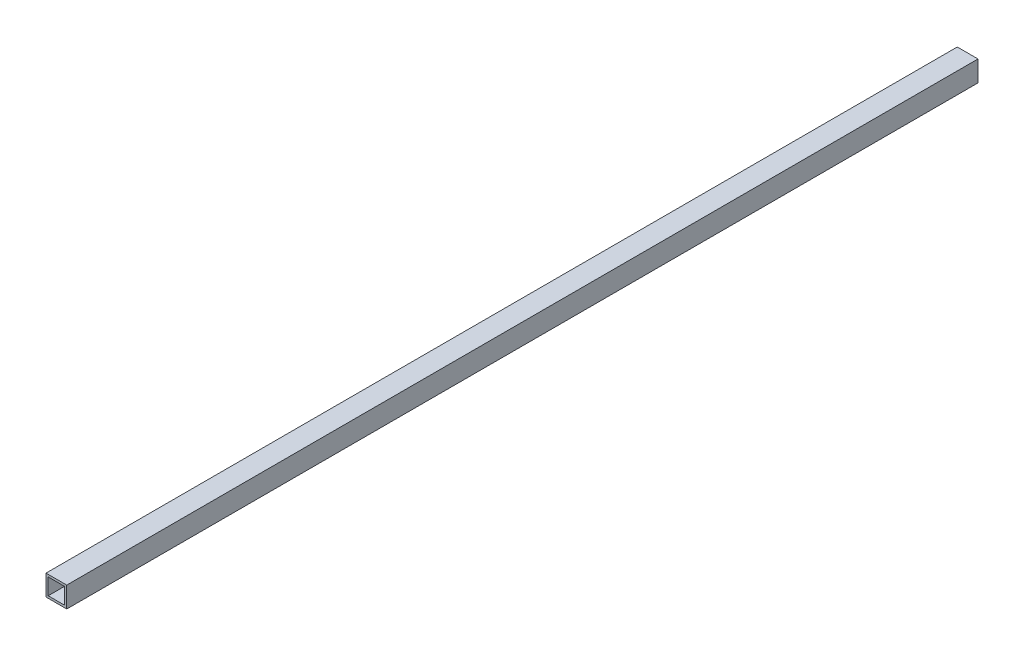
ISO-10303-21;
HEADER;
FILE_DESCRIPTION(('STEP AP214'),'2;1');
FILE_NAME('part.step','',(''),(''),'','','');
FILE_SCHEMA(('AUTOMOTIVE_DESIGN { 1 0 10303 214 1 1 1 1 }'));
ENDSEC;
DATA;
#1=APPLICATION_CONTEXT('core data for automotive mechanical design processes');
#2=APPLICATION_PROTOCOL_DEFINITION('international standard','automotive_design',2000,#1);
#3=PRODUCT_CONTEXT('',#1,'mechanical');
#4=PRODUCT('Part','Part','',(#3));
#5=PRODUCT_RELATED_PRODUCT_CATEGORY('part','',(#4));
#6=PRODUCT_DEFINITION_FORMATION('','',#4);
#7=PRODUCT_DEFINITION_CONTEXT('part definition',#1,'design');
#8=PRODUCT_DEFINITION('design','',#6,#7);
#9=PRODUCT_DEFINITION_SHAPE('','',#8);
#10=(LENGTH_UNIT() NAMED_UNIT(*) SI_UNIT(.MILLI.,.METRE.));
#11=(NAMED_UNIT(*) PLANE_ANGLE_UNIT() SI_UNIT($,.RADIAN.));
#12=(NAMED_UNIT(*) SI_UNIT($,.STERADIAN.) SOLID_ANGLE_UNIT());
#13=UNCERTAINTY_MEASURE_WITH_UNIT(LENGTH_MEASURE(1.E-05),#10,'distance_accuracy_value','');
#14=(GEOMETRIC_REPRESENTATION_CONTEXT(3) GLOBAL_UNCERTAINTY_ASSIGNED_CONTEXT((#13)) GLOBAL_UNIT_ASSIGNED_CONTEXT((#10,
#11,#12)) REPRESENTATION_CONTEXT('',''));
#15=CARTESIAN_POINT('',(0.,0.,0.));
#16=DIRECTION('',(0.,0.,1.));
#17=DIRECTION('',(1.,0.,0.));
#18=AXIS2_PLACEMENT_3D('',#15,#16,#17);
#19=CARTESIAN_POINT('',(0.,0.,615.));
#20=DIRECTION('',(0.,0.,1.));
#21=DIRECTION('',(1.,0.,0.));
#22=AXIS2_PLACEMENT_3D('',#19,#20,#21);
#23=PLANE('',#22);
#24=DIRECTION('',(0.,1.,0.));
#25=VECTOR('',#24,1.);
#26=CARTESIAN_POINT('',(7.,5.5,615.));
#27=LINE('',#26,#25);
#28=CARTESIAN_POINT('',(7.,-7.,615.));
#29=VERTEX_POINT('',#28);
#30=CARTESIAN_POINT('',(7.,7.,615.));
#31=VERTEX_POINT('',#30);
#32=EDGE_CURVE('E157',#29,#31,#27,.T.);
#33=ORIENTED_EDGE('',*,*,#32,.T.);
#34=DIRECTION('',(-1.,0.,0.));
#35=VECTOR('',#34,1.);
#36=CARTESIAN_POINT('',(-5.5,7.,615.));
#37=LINE('',#36,#35);
#38=CARTESIAN_POINT('',(-7.,7.,615.));
#39=VERTEX_POINT('',#38);
#40=EDGE_CURVE('E160',#31,#39,#37,.T.);
#41=ORIENTED_EDGE('',*,*,#40,.T.);
#42=DIRECTION('',(0.,-1.,0.));
#43=VECTOR('',#42,1.);
#44=CARTESIAN_POINT('',(-7.,5.5,615.));
#45=LINE('',#44,#43);
#46=CARTESIAN_POINT('',(-7.,-7.,615.));
#47=VERTEX_POINT('',#46);
#48=EDGE_CURVE('E163',#39,#47,#45,.T.);
#49=ORIENTED_EDGE('',*,*,#48,.T.);
#50=DIRECTION('',(1.,0.,0.));
#51=VECTOR('',#50,1.);
#52=CARTESIAN_POINT('',(-5.5,-7.,615.));
#53=LINE('',#52,#51);
#54=EDGE_CURVE('E165',#47,#29,#53,.T.);
#55=ORIENTED_EDGE('',*,*,#54,.T.);
#56=EDGE_LOOP('',(#33,#41,#49,#55));
#57=FACE_BOUND('',#56,.T.);
#58=DIRECTION('',(-1.,0.,0.));
#59=VECTOR('',#58,1.);
#60=CARTESIAN_POINT('',(-5.5,5.5,615.));
#61=LINE('',#60,#59);
#62=CARTESIAN_POINT('',(5.5,5.5,615.));
#63=VERTEX_POINT('',#62);
#64=CARTESIAN_POINT('',(-5.5,5.5,615.));
#65=VERTEX_POINT('',#64);
#66=EDGE_CURVE('E129',#63,#65,#61,.T.);
#67=ORIENTED_EDGE('',*,*,#66,.F.);
#68=DIRECTION('',(0.,1.,0.));
#69=VECTOR('',#68,1.);
#70=CARTESIAN_POINT('',(5.5,5.5,615.));
#71=LINE('',#70,#69);
#72=CARTESIAN_POINT('',(5.5,-5.5,615.));
#73=VERTEX_POINT('',#72);
#74=EDGE_CURVE('E121',#73,#63,#71,.T.);
#75=ORIENTED_EDGE('',*,*,#74,.F.);
#76=DIRECTION('',(1.,0.,0.));
#77=VECTOR('',#76,1.);
#78=CARTESIAN_POINT('',(-5.5,-5.5,615.));
#79=LINE('',#78,#77);
#80=CARTESIAN_POINT('',(-5.5,-5.5,615.));
#81=VERTEX_POINT('',#80);
#82=EDGE_CURVE('E143',#81,#73,#79,.T.);
#83=ORIENTED_EDGE('',*,*,#82,.F.);
#84=DIRECTION('',(0.,-1.,0.));
#85=VECTOR('',#84,1.);
#86=CARTESIAN_POINT('',(-5.5,5.5,615.));
#87=LINE('',#86,#85);
#88=EDGE_CURVE('E141',#65,#81,#87,.T.);
#89=ORIENTED_EDGE('',*,*,#88,.F.);
#90=EDGE_LOOP('',(#67,#75,#83,#89));
#91=FACE_BOUND('',#90,.T.);
#92=ADVANCED_FACE('F56',(#57,#91),#23,.T.);
#93=CARTESIAN_POINT('',(0.,0.,0.));
#94=DIRECTION('',(0.,0.,1.));
#95=DIRECTION('',(1.,0.,0.));
#96=AXIS2_PLACEMENT_3D('',#93,#94,#95);
#97=PLANE('',#96);
#98=DIRECTION('',(0.,1.,0.));
#99=VECTOR('',#98,1.);
#100=CARTESIAN_POINT('',(7.,5.5,0.));
#101=LINE('',#100,#99);
#102=CARTESIAN_POINT('',(7.,-7.,0.));
#103=VERTEX_POINT('',#102);
#104=CARTESIAN_POINT('',(7.,7.,0.));
#105=VERTEX_POINT('',#104);
#106=EDGE_CURVE('E137',#103,#105,#101,.T.);
#107=ORIENTED_EDGE('',*,*,#106,.F.);
#108=DIRECTION('',(1.,0.,0.));
#109=VECTOR('',#108,1.);
#110=CARTESIAN_POINT('',(-5.5,-7.,0.));
#111=LINE('',#110,#109);
#112=CARTESIAN_POINT('',(-7.,-7.,0.));
#113=VERTEX_POINT('',#112);
#114=EDGE_CURVE('E161',#113,#103,#111,.T.);
#115=ORIENTED_EDGE('',*,*,#114,.F.);
#116=DIRECTION('',(0.,-1.,0.));
#117=VECTOR('',#116,1.);
#118=CARTESIAN_POINT('',(-7.,5.5,0.));
#119=LINE('',#118,#117);
#120=CARTESIAN_POINT('',(-7.,7.,0.));
#121=VERTEX_POINT('',#120);
#122=EDGE_CURVE('E172',#121,#113,#119,.T.);
#123=ORIENTED_EDGE('',*,*,#122,.F.);
#124=DIRECTION('',(-1.,0.,0.));
#125=VECTOR('',#124,1.);
#126=CARTESIAN_POINT('',(-5.5,7.,0.));
#127=LINE('',#126,#125);
#128=EDGE_CURVE('E170',#105,#121,#127,.T.);
#129=ORIENTED_EDGE('',*,*,#128,.F.);
#130=EDGE_LOOP('',(#107,#115,#123,#129));
#131=FACE_BOUND('',#130,.T.);
#132=DIRECTION('',(0.,1.,0.));
#133=VECTOR('',#132,1.);
#134=CARTESIAN_POINT('',(5.5,5.5,0.));
#135=LINE('',#134,#133);
#136=CARTESIAN_POINT('',(5.5,-5.5,0.));
#137=VERTEX_POINT('',#136);
#138=CARTESIAN_POINT('',(5.5,5.5,0.));
#139=VERTEX_POINT('',#138);
#140=EDGE_CURVE('E79',#137,#139,#135,.T.);
#141=ORIENTED_EDGE('',*,*,#140,.T.);
#142=DIRECTION('',(-1.,0.,0.));
#143=VECTOR('',#142,1.);
#144=CARTESIAN_POINT('',(-5.5,5.5,0.));
#145=LINE('',#144,#143);
#146=CARTESIAN_POINT('',(-5.5,5.5,0.));
#147=VERTEX_POINT('',#146);
#148=EDGE_CURVE('E136',#139,#147,#145,.T.);
#149=ORIENTED_EDGE('',*,*,#148,.T.);
#150=DIRECTION('',(0.,-1.,0.));
#151=VECTOR('',#150,1.);
#152=CARTESIAN_POINT('',(-5.5,5.5,0.));
#153=LINE('',#152,#151);
#154=CARTESIAN_POINT('',(-5.5,-5.5,0.));
#155=VERTEX_POINT('',#154);
#156=EDGE_CURVE('E149',#147,#155,#153,.T.);
#157=ORIENTED_EDGE('',*,*,#156,.T.);
#158=DIRECTION('',(1.,0.,0.));
#159=VECTOR('',#158,1.);
#160=CARTESIAN_POINT('',(-5.5,-5.5,0.));
#161=LINE('',#160,#159);
#162=EDGE_CURVE('E130',#155,#137,#161,.T.);
#163=ORIENTED_EDGE('',*,*,#162,.T.);
#164=EDGE_LOOP('',(#141,#149,#157,#163));
#165=FACE_BOUND('',#164,.T.);
#166=ADVANCED_FACE('F190',(#131,#165),#97,.F.);
#167=CARTESIAN_POINT('',(7.,5.5,615.));
#168=DIRECTION('',(-1.,0.,0.));
#169=DIRECTION('',(0.,-1.,0.));
#170=AXIS2_PLACEMENT_3D('',#167,#168,#169);
#171=PLANE('',#170);
#172=ORIENTED_EDGE('',*,*,#106,.T.);
#173=DIRECTION('',(0.,0.,-1.));
#174=VECTOR('',#173,1.);
#175=CARTESIAN_POINT('',(7.,7.,615.));
#176=LINE('',#175,#174);
#177=EDGE_CURVE('E12',#31,#105,#176,.T.);
#178=ORIENTED_EDGE('',*,*,#177,.F.);
#179=ORIENTED_EDGE('',*,*,#32,.F.);
#180=DIRECTION('',(0.,0.,-1.));
#181=VECTOR('',#180,1.);
#182=CARTESIAN_POINT('',(7.,-7.,615.));
#183=LINE('',#182,#181);
#184=EDGE_CURVE('E167',#29,#103,#183,.T.);
#185=ORIENTED_EDGE('',*,*,#184,.T.);
#186=EDGE_LOOP('',(#172,#178,#179,#185));
#187=FACE_BOUND('',#186,.T.);
#188=ADVANCED_FACE('F58',(#187),#171,.F.);
#189=CARTESIAN_POINT('',(-5.5,7.,615.));
#190=DIRECTION('',(0.,-1.,0.));
#191=DIRECTION('',(0.,0.,-1.));
#192=AXIS2_PLACEMENT_3D('',#189,#190,#191);
#193=PLANE('',#192);
#194=ORIENTED_EDGE('',*,*,#128,.T.);
#195=DIRECTION('',(0.,0.,-1.));
#196=VECTOR('',#195,1.);
#197=CARTESIAN_POINT('',(-7.,7.,615.));
#198=LINE('',#197,#196);
#199=EDGE_CURVE('E64',#39,#121,#198,.T.);
#200=ORIENTED_EDGE('',*,*,#199,.F.);
#201=ORIENTED_EDGE('',*,*,#40,.F.);
#202=ORIENTED_EDGE('',*,*,#177,.T.);
#203=EDGE_LOOP('',(#194,#200,#201,#202));
#204=FACE_BOUND('',#203,.T.);
#205=ADVANCED_FACE('F200',(#204),#193,.F.);
#206=CARTESIAN_POINT('',(-7.,5.5,615.));
#207=DIRECTION('',(1.,0.,0.));
#208=DIRECTION('',(0.,1.,0.));
#209=AXIS2_PLACEMENT_3D('',#206,#207,#208);
#210=PLANE('',#209);
#211=ORIENTED_EDGE('',*,*,#122,.T.);
#212=DIRECTION('',(0.,0.,-1.));
#213=VECTOR('',#212,1.);
#214=CARTESIAN_POINT('',(-7.,-7.,615.));
#215=LINE('',#214,#213);
#216=EDGE_CURVE('E177',#47,#113,#215,.T.);
#217=ORIENTED_EDGE('',*,*,#216,.F.);
#218=ORIENTED_EDGE('',*,*,#48,.F.);
#219=ORIENTED_EDGE('',*,*,#199,.T.);
#220=EDGE_LOOP('',(#211,#217,#218,#219));
#221=FACE_BOUND('',#220,.T.);
#222=ADVANCED_FACE('F184',(#221),#210,.F.);
#223=CARTESIAN_POINT('',(-5.5,-7.,615.));
#224=DIRECTION('',(0.,1.,0.));
#225=DIRECTION('',(0.,0.,1.));
#226=AXIS2_PLACEMENT_3D('',#223,#224,#225);
#227=PLANE('',#226);
#228=ORIENTED_EDGE('',*,*,#114,.T.);
#229=ORIENTED_EDGE('',*,*,#184,.F.);
#230=ORIENTED_EDGE('',*,*,#54,.F.);
#231=ORIENTED_EDGE('',*,*,#216,.T.);
#232=EDGE_LOOP('',(#228,#229,#230,#231));
#233=FACE_BOUND('',#232,.T.);
#234=ADVANCED_FACE('F194',(#233),#227,.F.);
#235=CARTESIAN_POINT('',(5.5,5.5,615.));
#236=DIRECTION('',(-1.,0.,0.));
#237=DIRECTION('',(0.,-1.,0.));
#238=AXIS2_PLACEMENT_3D('',#235,#236,#237);
#239=PLANE('',#238);
#240=ORIENTED_EDGE('',*,*,#140,.F.);
#241=DIRECTION('',(0.,0.,-1.));
#242=VECTOR('',#241,1.);
#243=CARTESIAN_POINT('',(5.5,-5.5,615.));
#244=LINE('',#243,#242);
#245=EDGE_CURVE('E125',#73,#137,#244,.T.);
#246=ORIENTED_EDGE('',*,*,#245,.F.);
#247=ORIENTED_EDGE('',*,*,#74,.T.);
#248=DIRECTION('',(0.,0.,-1.));
#249=VECTOR('',#248,1.);
#250=CARTESIAN_POINT('',(5.5,5.5,615.));
#251=LINE('',#250,#249);
#252=EDGE_CURVE('E124',#63,#139,#251,.T.);
#253=ORIENTED_EDGE('',*,*,#252,.T.);
#254=EDGE_LOOP('',(#240,#246,#247,#253));
#255=FACE_BOUND('',#254,.T.);
#256=ADVANCED_FACE('F123',(#255),#239,.T.);
#257=CARTESIAN_POINT('',(-5.5,5.5,615.));
#258=DIRECTION('',(0.,-1.,0.));
#259=DIRECTION('',(0.,0.,-1.));
#260=AXIS2_PLACEMENT_3D('',#257,#258,#259);
#261=PLANE('',#260);
#262=ORIENTED_EDGE('',*,*,#148,.F.);
#263=ORIENTED_EDGE('',*,*,#252,.F.);
#264=ORIENTED_EDGE('',*,*,#66,.T.);
#265=DIRECTION('',(0.,0.,-1.));
#266=VECTOR('',#265,1.);
#267=CARTESIAN_POINT('',(-5.5,5.5,615.));
#268=LINE('',#267,#266);
#269=EDGE_CURVE('E138',#65,#147,#268,.T.);
#270=ORIENTED_EDGE('',*,*,#269,.T.);
#271=EDGE_LOOP('',(#262,#263,#264,#270));
#272=FACE_BOUND('',#271,.T.);
#273=ADVANCED_FACE('F133',(#272),#261,.T.);
#274=CARTESIAN_POINT('',(-5.5,5.5,615.));
#275=DIRECTION('',(1.,0.,0.));
#276=DIRECTION('',(0.,1.,0.));
#277=AXIS2_PLACEMENT_3D('',#274,#275,#276);
#278=PLANE('',#277);
#279=ORIENTED_EDGE('',*,*,#156,.F.);
#280=ORIENTED_EDGE('',*,*,#269,.F.);
#281=ORIENTED_EDGE('',*,*,#88,.T.);
#282=DIRECTION('',(0.,0.,-1.));
#283=VECTOR('',#282,1.);
#284=CARTESIAN_POINT('',(-5.5,-5.5,615.));
#285=LINE('',#284,#283);
#286=EDGE_CURVE('E71',#81,#155,#285,.T.);
#287=ORIENTED_EDGE('',*,*,#286,.T.);
#288=EDGE_LOOP('',(#279,#280,#281,#287));
#289=FACE_BOUND('',#288,.T.);
#290=ADVANCED_FACE('F223',(#289),#278,.T.);
#291=CARTESIAN_POINT('',(-5.5,-5.5,615.));
#292=DIRECTION('',(0.,1.,0.));
#293=DIRECTION('',(0.,0.,1.));
#294=AXIS2_PLACEMENT_3D('',#291,#292,#293);
#295=PLANE('',#294);
#296=ORIENTED_EDGE('',*,*,#162,.F.);
#297=ORIENTED_EDGE('',*,*,#286,.F.);
#298=ORIENTED_EDGE('',*,*,#82,.T.);
#299=ORIENTED_EDGE('',*,*,#245,.T.);
#300=EDGE_LOOP('',(#296,#297,#298,#299));
#301=FACE_BOUND('',#300,.T.);
#302=ADVANCED_FACE('F227',(#301),#295,.T.);
#303=CLOSED_SHELL('',(#92,#166,#188,#205,#222,#234,#256,#273,#290,#302));
#304=MANIFOLD_SOLID_BREP('B2',#303);
#305=ADVANCED_BREP_SHAPE_REPRESENTATION('',(#18,#304),#14);
#306=SHAPE_DEFINITION_REPRESENTATION(#9,#305);
ENDSEC;
END-ISO-10303-21;
